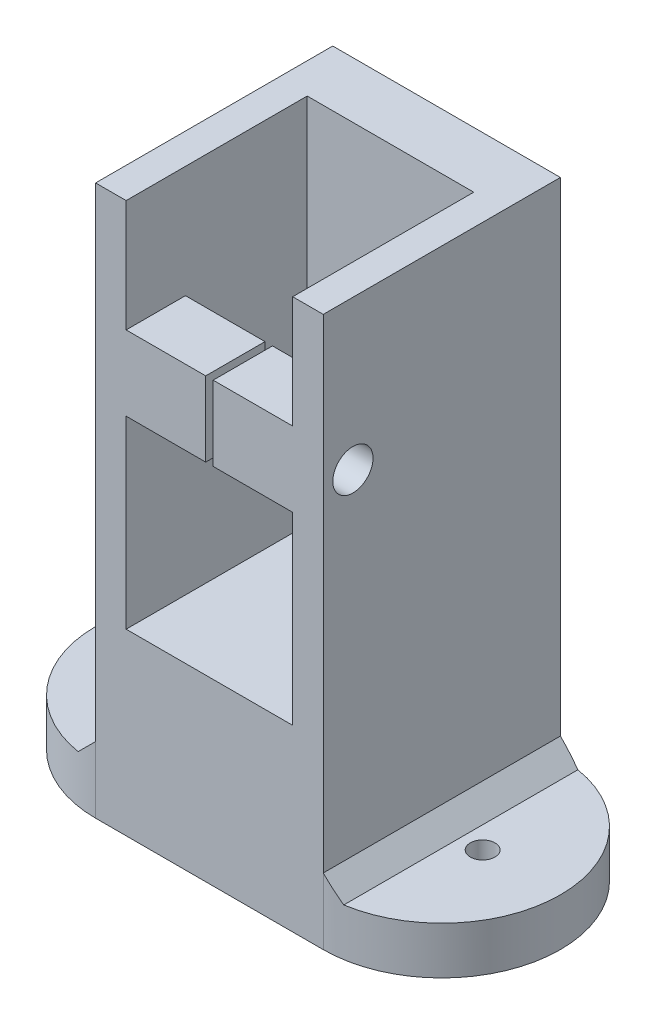
ISO-10303-21;
HEADER;
FILE_DESCRIPTION(('STEP AP214'),'2;1');
FILE_NAME('part.step','',(''),(''),'','','');
FILE_SCHEMA(('AUTOMOTIVE_DESIGN { 1 0 10303 214 1 1 1 1 }'));
ENDSEC;
DATA;
#1=APPLICATION_CONTEXT('core data for automotive mechanical design processes');
#2=APPLICATION_PROTOCOL_DEFINITION('international standard','automotive_design',2000,#1);
#3=PRODUCT_CONTEXT('',#1,'mechanical');
#4=PRODUCT('Part','Part','',(#3));
#5=PRODUCT_RELATED_PRODUCT_CATEGORY('part','',(#4));
#6=PRODUCT_DEFINITION_FORMATION('','',#4);
#7=PRODUCT_DEFINITION_CONTEXT('part definition',#1,'design');
#8=PRODUCT_DEFINITION('design','',#6,#7);
#9=PRODUCT_DEFINITION_SHAPE('','',#8);
#10=(LENGTH_UNIT() NAMED_UNIT(*) SI_UNIT(.MILLI.,.METRE.));
#11=(NAMED_UNIT(*) PLANE_ANGLE_UNIT() SI_UNIT($,.RADIAN.));
#12=(NAMED_UNIT(*) SI_UNIT($,.STERADIAN.) SOLID_ANGLE_UNIT());
#13=UNCERTAINTY_MEASURE_WITH_UNIT(LENGTH_MEASURE(1.E-05),#10,'distance_accuracy_value','');
#14=(GEOMETRIC_REPRESENTATION_CONTEXT(3) GLOBAL_UNCERTAINTY_ASSIGNED_CONTEXT((#13)) GLOBAL_UNIT_ASSIGNED_CONTEXT((#10,
#11,#12)) REPRESENTATION_CONTEXT('',''));
#15=CARTESIAN_POINT('',(0.,0.,0.));
#16=DIRECTION('',(0.,0.,1.));
#17=DIRECTION('',(1.,0.,0.));
#18=AXIS2_PLACEMENT_3D('',#15,#16,#17);
#19=CARTESIAN_POINT('',(4.09,73.66,-24.240000034));
#20=DIRECTION('',(-1.,0.,0.));
#21=DIRECTION('',(0.,-1.,0.));
#22=AXIS2_PLACEMENT_3D('',#19,#20,#21);
#23=PLANE('',#22);
#24=DIRECTION('',(0.,0.,-1.));
#25=VECTOR('',#24,1.);
#26=CARTESIAN_POINT('',(4.09,48.66,0.));
#27=LINE('',#26,#25);
#28=CARTESIAN_POINT('',(4.09,48.66,0.));
#29=VERTEX_POINT('',#28);
#30=CARTESIAN_POINT('',(4.09,48.66,-7.940000122));
#31=VERTEX_POINT('',#30);
#32=EDGE_CURVE('E658',#29,#31,#27,.T.);
#33=ORIENTED_EDGE('',*,*,#32,.F.);
#34=DIRECTION('',(0.,-1.,0.));
#35=VECTOR('',#34,1.);
#36=CARTESIAN_POINT('',(4.09,73.66,0.));
#37=LINE('',#36,#35);
#38=CARTESIAN_POINT('',(4.09,23.960000086,0.));
#39=VERTEX_POINT('',#38);
#40=EDGE_CURVE('E639',#29,#39,#37,.T.);
#41=ORIENTED_EDGE('',*,*,#40,.T.);
#42=DIRECTION('',(0.,0.,1.));
#43=VECTOR('',#42,1.);
#44=CARTESIAN_POINT('',(4.09,23.960000086,-24.240000034));
#45=LINE('',#44,#43);
#46=CARTESIAN_POINT('',(4.09,23.960000086,-24.240000034));
#47=VERTEX_POINT('',#46);
#48=EDGE_CURVE('E229',#47,#39,#45,.T.);
#49=ORIENTED_EDGE('',*,*,#48,.F.);
#50=DIRECTION('',(0.,-1.,0.));
#51=VECTOR('',#50,1.);
#52=CARTESIAN_POINT('',(4.09,73.66,-24.240000034));
#53=LINE('',#52,#51);
#54=CARTESIAN_POINT('',(4.09,73.66,-24.240000034));
#55=VERTEX_POINT('',#54);
#56=EDGE_CURVE('E216',#55,#47,#53,.T.);
#57=ORIENTED_EDGE('',*,*,#56,.F.);
#58=DIRECTION('',(0.,0.,1.));
#59=VECTOR('',#58,1.);
#60=CARTESIAN_POINT('',(4.09,73.66,-24.240000034));
#61=LINE('',#60,#59);
#62=CARTESIAN_POINT('',(4.09,73.66,0.));
#63=VERTEX_POINT('',#62);
#64=EDGE_CURVE('E222',#55,#63,#61,.T.);
#65=ORIENTED_EDGE('',*,*,#64,.T.);
#66=CARTESIAN_POINT('',(4.09,58.66,0.));
#67=VERTEX_POINT('',#66);
#68=EDGE_CURVE('E218',#63,#67,#37,.T.);
#69=ORIENTED_EDGE('',*,*,#68,.T.);
#70=DIRECTION('',(0.,0.,1.));
#71=VECTOR('',#70,1.);
#72=CARTESIAN_POINT('',(4.09,58.66,0.));
#73=LINE('',#72,#71);
#74=CARTESIAN_POINT('',(4.09,58.66,-7.940000122));
#75=VERTEX_POINT('',#74);
#76=EDGE_CURVE('E655',#75,#67,#73,.T.);
#77=ORIENTED_EDGE('',*,*,#76,.F.);
#78=DIRECTION('',(0.,1.,0.));
#79=VECTOR('',#78,1.);
#80=CARTESIAN_POINT('',(4.09,58.66,-7.940000122));
#81=LINE('',#80,#79);
#82=EDGE_CURVE('E72',#31,#75,#81,.T.);
#83=ORIENTED_EDGE('',*,*,#82,.F.);
#84=EDGE_LOOP('',(#33,#41,#49,#57,#65,#69,#77,#83));
#85=FACE_BOUND('',#84,.T.);
#86=ADVANCED_FACE('F47',(#85),#23,.F.);
#87=CARTESIAN_POINT('',(0.,6.35,-15.875));
#88=DIRECTION('',(0.,-1.,0.));
#89=DIRECTION('',(0.,0.,-1.));
#90=AXIS2_PLACEMENT_3D('',#87,#88,#89);
#91=CYLINDRICAL_SURFACE('',#90,15.875);
#92=CARTESIAN_POINT('',(0.,0.,-15.875));
#93=DIRECTION('',(0.,1.,0.));
#94=DIRECTION('',(0.,0.,1.));
#95=AXIS2_PLACEMENT_3D('',#92,#93,#94);
#96=CIRCLE('',#95,15.875);
#97=CARTESIAN_POINT('',(0.,0.,0.));
#98=VERTEX_POINT('',#97);
#99=CARTESIAN_POINT('',(0.,0.,-31.75));
#100=VERTEX_POINT('',#99);
#101=EDGE_CURVE('E282',#98,#100,#96,.F.);
#102=ORIENTED_EDGE('',*,*,#101,.F.);
#103=DIRECTION('',(0.,-1.,0.));
#104=VECTOR('',#103,1.);
#105=CARTESIAN_POINT('',(0.,6.35,0.));
#106=LINE('',#105,#104);
#107=CARTESIAN_POINT('',(0.,8.89,0.));
#108=VERTEX_POINT('',#107);
#109=EDGE_CURVE('E291',#108,#98,#106,.T.);
#110=ORIENTED_EDGE('',*,*,#109,.F.);
#111=CARTESIAN_POINT('',(0.,8.89,-15.875));
#112=DIRECTION('',(-0.707106781186545,0.70710678118655,0.));
#113=DIRECTION('',(-0.70710678118655,-0.707106781186545,0.));
#114=AXIS2_PLACEMENT_3D('',#111,#112,#113);
#115=ELLIPSE('',#114,22.4506403026728,15.875);
#116=CARTESIAN_POINT('',(-2.54000000000001,6.35,-0.20451739734861));
#117=VERTEX_POINT('',#116);
#118=EDGE_CURVE('E12',#108,#117,#115,.F.);
#119=ORIENTED_EDGE('',*,*,#118,.T.);
#120=CARTESIAN_POINT('',(0.,6.35,-15.875));
#121=DIRECTION('',(0.,1.,0.));
#122=DIRECTION('',(0.,0.,1.));
#123=AXIS2_PLACEMENT_3D('',#120,#121,#122);
#124=CIRCLE('',#123,15.875);
#125=CARTESIAN_POINT('',(-2.54000000000002,6.35,-31.5454826026514));
#126=VERTEX_POINT('',#125);
#127=EDGE_CURVE('E281',#117,#126,#124,.F.);
#128=ORIENTED_EDGE('',*,*,#127,.T.);
#129=CARTESIAN_POINT('',(0.,8.89,-15.875));
#130=DIRECTION('',(-0.707106781186545,0.70710678118655,0.));
#131=DIRECTION('',(-0.70710678118655,-0.707106781186545,0.));
#132=AXIS2_PLACEMENT_3D('',#129,#130,#131);
#133=ELLIPSE('',#132,22.4506403026728,15.875);
#134=CARTESIAN_POINT('',(0.,8.89,-31.75));
#135=VERTEX_POINT('',#134);
#136=EDGE_CURVE('E57',#126,#135,#133,.F.);
#137=ORIENTED_EDGE('',*,*,#136,.T.);
#138=DIRECTION('',(0.,-1.,0.));
#139=VECTOR('',#138,1.);
#140=CARTESIAN_POINT('',(0.,6.35,-31.75));
#141=LINE('',#140,#139);
#142=EDGE_CURVE('E285',#135,#100,#141,.T.);
#143=ORIENTED_EDGE('',*,*,#142,.T.);
#144=EDGE_LOOP('',(#102,#110,#119,#128,#137,#143));
#145=FACE_BOUND('',#144,.T.);
#146=ADVANCED_FACE('F313',(#145),#91,.T.);
#147=CARTESIAN_POINT('',(-5.461,6.35,-15.875));
#148=DIRECTION('',(0.,-1.,0.));
#149=DIRECTION('',(0.,0.,-1.));
#150=AXIS2_PLACEMENT_3D('',#147,#148,#149);
#151=CYLINDRICAL_SURFACE('',#150,1.651);
#152=CARTESIAN_POINT('',(-5.461,6.35,-15.875));
#153=DIRECTION('',(0.,1.,0.));
#154=DIRECTION('',(0.,0.,1.));
#155=AXIS2_PLACEMENT_3D('',#152,#153,#154);
#156=CIRCLE('',#155,1.651);
#157=CARTESIAN_POINT('',(-5.461,6.35,-14.224));
#158=VERTEX_POINT('',#157);
#159=EDGE_CURVE('E278',#158,#158,#156,.T.);
#160=ORIENTED_EDGE('',*,*,#159,.T.);
#161=EDGE_LOOP('',(#160));
#162=FACE_BOUND('',#161,.T.);
#163=CARTESIAN_POINT('',(-5.461,0.,-15.875));
#164=DIRECTION('',(0.,1.,0.));
#165=DIRECTION('',(0.,0.,1.));
#166=AXIS2_PLACEMENT_3D('',#163,#164,#165);
#167=CIRCLE('',#166,1.651);
#168=CARTESIAN_POINT('',(-5.461,0.,-14.224));
#169=VERTEX_POINT('',#168);
#170=EDGE_CURVE('E277',#169,#169,#167,.T.);
#171=ORIENTED_EDGE('',*,*,#170,.F.);
#172=EDGE_LOOP('',(#171));
#173=FACE_BOUND('',#172,.T.);
#174=ADVANCED_FACE('F341',(#162,#173),#151,.F.);
#175=CARTESIAN_POINT('',(0.,6.35,0.));
#176=DIRECTION('',(0.,1.,0.));
#177=DIRECTION('',(0.,0.,1.));
#178=AXIS2_PLACEMENT_3D('',#175,#176,#177);
#179=PLANE('',#178);
#180=ORIENTED_EDGE('',*,*,#159,.F.);
#181=EDGE_LOOP('',(#180));
#182=FACE_BOUND('',#181,.T.);
#183=ORIENTED_EDGE('',*,*,#127,.F.);
#184=DIRECTION('',(0.,0.,-1.));
#185=VECTOR('',#184,1.);
#186=CARTESIAN_POINT('',(-2.54000000000002,6.35,-31.75));
#187=LINE('',#186,#185);
#188=EDGE_CURVE('E299',#117,#126,#187,.T.);
#189=ORIENTED_EDGE('',*,*,#188,.T.);
#190=EDGE_LOOP('',(#183,#189));
#191=FACE_BOUND('',#190,.T.);
#192=ADVANCED_FACE('F339',(#182,#191),#179,.T.);
#193=CARTESIAN_POINT('',(0.,0.,0.));
#194=DIRECTION('',(0.,1.,0.));
#195=DIRECTION('',(0.,0.,1.));
#196=AXIS2_PLACEMENT_3D('',#193,#194,#195);
#197=PLANE('',#196);
#198=ORIENTED_EDGE('',*,*,#170,.T.);
#199=EDGE_LOOP('',(#198));
#200=FACE_BOUND('',#199,.T.);
#201=ORIENTED_EDGE('',*,*,#101,.T.);
#202=DIRECTION('',(1.,0.,0.));
#203=VECTOR('',#202,1.);
#204=CARTESIAN_POINT('',(0.,0.,-31.75));
#205=LINE('',#204,#203);
#206=CARTESIAN_POINT('',(30.48,0.,-31.75));
#207=VERTEX_POINT('',#206);
#208=EDGE_CURVE('E263',#100,#207,#205,.T.);
#209=ORIENTED_EDGE('',*,*,#208,.T.);
#210=CARTESIAN_POINT('',(30.48,0.,-15.875));
#211=DIRECTION('',(0.,1.,0.));
#212=DIRECTION('',(0.,0.,1.));
#213=AXIS2_PLACEMENT_3D('',#210,#211,#212);
#214=CIRCLE('',#213,15.875);
#215=CARTESIAN_POINT('',(30.48,0.,0.));
#216=VERTEX_POINT('',#215);
#217=EDGE_CURVE('E237',#216,#207,#214,.T.);
#218=ORIENTED_EDGE('',*,*,#217,.F.);
#219=DIRECTION('',(1.,0.,0.));
#220=VECTOR('',#219,1.);
#221=CARTESIAN_POINT('',(0.,0.,0.));
#222=LINE('',#221,#220);
#223=EDGE_CURVE('E248',#98,#216,#222,.T.);
#224=ORIENTED_EDGE('',*,*,#223,.F.);
#225=EDGE_LOOP('',(#201,#209,#218,#224));
#226=FACE_BOUND('',#225,.T.);
#227=CARTESIAN_POINT('',(35.941,0.,-15.875));
#228=DIRECTION('',(0.,1.,0.));
#229=DIRECTION('',(0.,0.,1.));
#230=AXIS2_PLACEMENT_3D('',#227,#228,#229);
#231=CIRCLE('',#230,1.651);
#232=CARTESIAN_POINT('',(35.941,0.,-14.224));
#233=VERTEX_POINT('',#232);
#234=EDGE_CURVE('E224',#233,#233,#231,.T.);
#235=ORIENTED_EDGE('',*,*,#234,.T.);
#236=EDGE_LOOP('',(#235));
#237=FACE_BOUND('',#236,.T.);
#238=ADVANCED_FACE('F336',(#200,#226,#237),#197,.F.);
#239=CARTESIAN_POINT('',(0.,73.66,0.));
#240=DIRECTION('',(0.,0.,-1.));
#241=DIRECTION('',(-1.,0.,0.));
#242=AXIS2_PLACEMENT_3D('',#239,#240,#241);
#243=PLANE('',#242);
#244=DIRECTION('',(1.,0.,0.));
#245=VECTOR('',#244,1.);
#246=CARTESIAN_POINT('',(4.09,23.960000086,0.));
#247=LINE('',#246,#245);
#248=CARTESIAN_POINT('',(26.39,23.960000086,0.));
#249=VERTEX_POINT('',#248);
#250=EDGE_CURVE('E213',#39,#249,#247,.T.);
#251=ORIENTED_EDGE('',*,*,#250,.F.);
#252=ORIENTED_EDGE('',*,*,#40,.F.);
#253=DIRECTION('',(-1.,0.,0.));
#254=VECTOR('',#253,1.);
#255=CARTESIAN_POINT('',(28.0088528042796,48.66,0.));
#256=LINE('',#255,#254);
#257=CARTESIAN_POINT('',(14.74,48.66,0.));
#258=VERTEX_POINT('',#257);
#259=EDGE_CURVE('E650',#258,#29,#256,.T.);
#260=ORIENTED_EDGE('',*,*,#259,.F.);
#261=DIRECTION('',(0.,-1.,0.));
#262=VECTOR('',#261,1.);
#263=CARTESIAN_POINT('',(14.74,58.66,0.));
#264=LINE('',#263,#262);
#265=CARTESIAN_POINT('',(14.74,58.66,0.));
#266=VERTEX_POINT('',#265);
#267=EDGE_CURVE('E664',#266,#258,#264,.T.);
#268=ORIENTED_EDGE('',*,*,#267,.F.);
#269=DIRECTION('',(-1.,0.,0.));
#270=VECTOR('',#269,1.);
#271=CARTESIAN_POINT('',(28.0088528042796,58.66,0.));
#272=LINE('',#271,#270);
#273=EDGE_CURVE('E648',#266,#67,#272,.T.);
#274=ORIENTED_EDGE('',*,*,#273,.T.);
#275=ORIENTED_EDGE('',*,*,#68,.F.);
#276=DIRECTION('',(1.,0.,0.));
#277=VECTOR('',#276,1.);
#278=CARTESIAN_POINT('',(0.,73.66,0.));
#279=LINE('',#278,#277);
#280=CARTESIAN_POINT('',(0.,73.66,0.));
#281=VERTEX_POINT('',#280);
#282=EDGE_CURVE('E249',#281,#63,#279,.T.);
#283=ORIENTED_EDGE('',*,*,#282,.F.);
#284=DIRECTION('',(0.,-1.,0.));
#285=VECTOR('',#284,1.);
#286=CARTESIAN_POINT('',(0.,73.66,0.));
#287=LINE('',#286,#285);
#288=EDGE_CURVE('E260',#281,#108,#287,.T.);
#289=ORIENTED_EDGE('',*,*,#288,.T.);
#290=ORIENTED_EDGE('',*,*,#109,.T.);
#291=ORIENTED_EDGE('',*,*,#223,.T.);
#292=DIRECTION('',(0.,-1.,0.));
#293=VECTOR('',#292,1.);
#294=CARTESIAN_POINT('',(30.48,6.35,0.));
#295=LINE('',#294,#293);
#296=CARTESIAN_POINT('',(30.48,8.89000000000001,0.));
#297=VERTEX_POINT('',#296);
#298=EDGE_CURVE('E246',#297,#216,#295,.T.);
#299=ORIENTED_EDGE('',*,*,#298,.F.);
#300=DIRECTION('',(0.,-1.,0.));
#301=VECTOR('',#300,1.);
#302=CARTESIAN_POINT('',(30.48,73.66,0.));
#303=LINE('',#302,#301);
#304=CARTESIAN_POINT('',(30.48,73.66,0.));
#305=VERTEX_POINT('',#304);
#306=EDGE_CURVE('E274',#305,#297,#303,.T.);
#307=ORIENTED_EDGE('',*,*,#306,.F.);
#308=CARTESIAN_POINT('',(26.39,73.66,0.));
#309=VERTEX_POINT('',#308);
#310=EDGE_CURVE('E211',#309,#305,#279,.T.);
#311=ORIENTED_EDGE('',*,*,#310,.F.);
#312=DIRECTION('',(0.,1.,0.));
#313=VECTOR('',#312,1.);
#314=CARTESIAN_POINT('',(26.39,73.66,0.));
#315=LINE('',#314,#313);
#316=CARTESIAN_POINT('',(26.39,58.66,0.));
#317=VERTEX_POINT('',#316);
#318=EDGE_CURVE('E202',#317,#309,#315,.T.);
#319=ORIENTED_EDGE('',*,*,#318,.F.);
#320=DIRECTION('',(1.,0.,0.));
#321=VECTOR('',#320,1.);
#322=CARTESIAN_POINT('',(2.47114719572036,58.66,0.));
#323=LINE('',#322,#321);
#324=CARTESIAN_POINT('',(15.74,58.66,0.));
#325=VERTEX_POINT('',#324);
#326=EDGE_CURVE('E187',#325,#317,#323,.T.);
#327=ORIENTED_EDGE('',*,*,#326,.F.);
#328=DIRECTION('',(0.,1.,0.));
#329=VECTOR('',#328,1.);
#330=CARTESIAN_POINT('',(15.74,58.66,0.));
#331=LINE('',#330,#329);
#332=CARTESIAN_POINT('',(15.74,48.66,0.));
#333=VERTEX_POINT('',#332);
#334=EDGE_CURVE('E677',#333,#325,#331,.T.);
#335=ORIENTED_EDGE('',*,*,#334,.F.);
#336=DIRECTION('',(1.,0.,0.));
#337=VECTOR('',#336,1.);
#338=CARTESIAN_POINT('',(2.47114719572036,48.66,0.));
#339=LINE('',#338,#337);
#340=CARTESIAN_POINT('',(26.39,48.66,0.));
#341=VERTEX_POINT('',#340);
#342=EDGE_CURVE('E624',#333,#341,#339,.T.);
#343=ORIENTED_EDGE('',*,*,#342,.T.);
#344=EDGE_CURVE('E212',#249,#341,#315,.T.);
#345=ORIENTED_EDGE('',*,*,#344,.F.);
#346=EDGE_LOOP('',(#251,#252,#260,#268,#274,#275,#283,#289,#290,#291,#299,#307,#311,#319,#327,
#335,#343,#345));
#347=FACE_BOUND('',#346,.T.);
#348=ADVANCED_FACE('F209',(#347),#243,.F.);
#349=CARTESIAN_POINT('',(30.48,73.66,0.));
#350=DIRECTION('',(-1.,0.,0.));
#351=DIRECTION('',(0.,0.,1.));
#352=AXIS2_PLACEMENT_3D('',#349,#350,#351);
#353=PLANE('',#352);
#354=CARTESIAN_POINT('',(30.48,53.66,-3.970000061));
#355=DIRECTION('',(-1.,0.,0.));
#356=DIRECTION('',(0.,0.,1.));
#357=AXIS2_PLACEMENT_3D('',#354,#355,#356);
#358=CIRCLE('',#357,2.694750008);
#359=CARTESIAN_POINT('',(30.48,53.66,-1.275250053));
#360=VERTEX_POINT('',#359);
#361=EDGE_CURVE('E205',#360,#360,#358,.T.);
#362=ORIENTED_EDGE('',*,*,#361,.T.);
#363=EDGE_LOOP('',(#362));
#364=FACE_BOUND('',#363,.T.);
#365=ORIENTED_EDGE('',*,*,#306,.T.);
#366=DIRECTION('',(0.,0.,-1.));
#367=VECTOR('',#366,1.);
#368=CARTESIAN_POINT('',(30.48,8.89000000000001,0.));
#369=LINE('',#368,#367);
#370=CARTESIAN_POINT('',(30.48,8.89000000000001,-31.75));
#371=VERTEX_POINT('',#370);
#372=EDGE_CURVE('E294',#297,#371,#369,.T.);
#373=ORIENTED_EDGE('',*,*,#372,.T.);
#374=DIRECTION('',(0.,-1.,0.));
#375=VECTOR('',#374,1.);
#376=CARTESIAN_POINT('',(30.48,73.66,-31.75));
#377=LINE('',#376,#375);
#378=CARTESIAN_POINT('',(30.48,73.66,-31.75));
#379=VERTEX_POINT('',#378);
#380=EDGE_CURVE('E271',#379,#371,#377,.T.);
#381=ORIENTED_EDGE('',*,*,#380,.F.);
#382=DIRECTION('',(0.,0.,-1.));
#383=VECTOR('',#382,1.);
#384=CARTESIAN_POINT('',(30.48,73.66,0.));
#385=LINE('',#384,#383);
#386=EDGE_CURVE('E252',#305,#379,#385,.T.);
#387=ORIENTED_EDGE('',*,*,#386,.F.);
#388=EDGE_LOOP('',(#365,#373,#381,#387));
#389=FACE_BOUND('',#388,.T.);
#390=ADVANCED_FACE('F385',(#364,#389),#353,.F.);
#391=CARTESIAN_POINT('',(0.,73.66,-31.75));
#392=DIRECTION('',(0.,0.,-1.));
#393=DIRECTION('',(-1.,0.,0.));
#394=AXIS2_PLACEMENT_3D('',#391,#392,#393);
#395=PLANE('',#394);
#396=CARTESIAN_POINT('',(15.24,28.370000086,-31.75));
#397=DIRECTION('',(0.,0.,-1.));
#398=DIRECTION('',(-1.,0.,0.));
#399=AXIS2_PLACEMENT_3D('',#396,#397,#398);
#400=CIRCLE('',#399,2.99085000000001);
#401=CARTESIAN_POINT('',(12.24915,28.370000086,-31.75));
#402=VERTEX_POINT('',#401);
#403=EDGE_CURVE('E640',#402,#402,#400,.T.);
#404=ORIENTED_EDGE('',*,*,#403,.F.);
#405=EDGE_LOOP('',(#404));
#406=FACE_BOUND('',#405,.T.);
#407=ORIENTED_EDGE('',*,*,#208,.F.);
#408=ORIENTED_EDGE('',*,*,#142,.F.);
#409=DIRECTION('',(0.,-1.,0.));
#410=VECTOR('',#409,1.);
#411=CARTESIAN_POINT('',(0.,73.66,-31.75));
#412=LINE('',#411,#410);
#413=CARTESIAN_POINT('',(0.,73.66,-31.75));
#414=VERTEX_POINT('',#413);
#415=EDGE_CURVE('E268',#414,#135,#412,.T.);
#416=ORIENTED_EDGE('',*,*,#415,.F.);
#417=DIRECTION('',(1.,0.,0.));
#418=VECTOR('',#417,1.);
#419=CARTESIAN_POINT('',(0.,73.66,-31.75));
#420=LINE('',#419,#418);
#421=EDGE_CURVE('E254',#414,#379,#420,.T.);
#422=ORIENTED_EDGE('',*,*,#421,.T.);
#423=ORIENTED_EDGE('',*,*,#380,.T.);
#424=DIRECTION('',(0.,-1.,0.));
#425=VECTOR('',#424,1.);
#426=CARTESIAN_POINT('',(30.48,6.35,-31.75));
#427=LINE('',#426,#425);
#428=EDGE_CURVE('E240',#371,#207,#427,.T.);
#429=ORIENTED_EDGE('',*,*,#428,.T.);
#430=EDGE_LOOP('',(#407,#408,#416,#422,#423,#429));
#431=FACE_BOUND('',#430,.T.);
#432=ADVANCED_FACE('F333',(#406,#431),#395,.T.);
#433=CARTESIAN_POINT('',(0.,73.66,0.));
#434=DIRECTION('',(-1.,0.,0.));
#435=DIRECTION('',(0.,0.,1.));
#436=AXIS2_PLACEMENT_3D('',#433,#434,#435);
#437=PLANE('',#436);
#438=CARTESIAN_POINT('',(0.,53.66,-3.970000061));
#439=DIRECTION('',(-1.,0.,0.));
#440=DIRECTION('',(0.,0.,1.));
#441=AXIS2_PLACEMENT_3D('',#438,#439,#440);
#442=CIRCLE('',#441,2.694750008);
#443=CARTESIAN_POINT('',(0.,53.66,-1.275250053));
#444=VERTEX_POINT('',#443);
#445=EDGE_CURVE('E690',#444,#444,#442,.T.);
#446=ORIENTED_EDGE('',*,*,#445,.F.);
#447=EDGE_LOOP('',(#446));
#448=FACE_BOUND('',#447,.T.);
#449=ORIENTED_EDGE('',*,*,#415,.T.);
#450=DIRECTION('',(0.,0.,1.));
#451=VECTOR('',#450,1.);
#452=CARTESIAN_POINT('',(0.,8.89,0.));
#453=LINE('',#452,#451);
#454=EDGE_CURVE('E302',#135,#108,#453,.T.);
#455=ORIENTED_EDGE('',*,*,#454,.T.);
#456=ORIENTED_EDGE('',*,*,#288,.F.);
#457=DIRECTION('',(0.,0.,-1.));
#458=VECTOR('',#457,1.);
#459=CARTESIAN_POINT('',(0.,73.66,0.));
#460=LINE('',#459,#458);
#461=EDGE_CURVE('E257',#281,#414,#460,.T.);
#462=ORIENTED_EDGE('',*,*,#461,.T.);
#463=EDGE_LOOP('',(#449,#455,#456,#462));
#464=FACE_BOUND('',#463,.T.);
#465=ADVANCED_FACE('F320',(#448,#464),#437,.T.);
#466=CARTESIAN_POINT('',(0.,73.66,0.));
#467=DIRECTION('',(0.,1.,0.));
#468=DIRECTION('',(0.,0.,1.));
#469=AXIS2_PLACEMENT_3D('',#466,#467,#468);
#470=PLANE('',#469);
#471=ORIENTED_EDGE('',*,*,#64,.F.);
#472=DIRECTION('',(-1.,0.,0.));
#473=VECTOR('',#472,1.);
#474=CARTESIAN_POINT('',(4.09,73.66,-24.240000034));
#475=LINE('',#474,#473);
#476=CARTESIAN_POINT('',(26.39,73.66,-24.240000034));
#477=VERTEX_POINT('',#476);
#478=EDGE_CURVE('E232',#477,#55,#475,.T.);
#479=ORIENTED_EDGE('',*,*,#478,.F.);
#480=DIRECTION('',(0.,0.,1.));
#481=VECTOR('',#480,1.);
#482=CARTESIAN_POINT('',(26.39,73.66,-24.240000034));
#483=LINE('',#482,#481);
#484=EDGE_CURVE('E225',#477,#309,#483,.T.);
#485=ORIENTED_EDGE('',*,*,#484,.T.);
#486=ORIENTED_EDGE('',*,*,#310,.T.);
#487=ORIENTED_EDGE('',*,*,#386,.T.);
#488=ORIENTED_EDGE('',*,*,#421,.F.);
#489=ORIENTED_EDGE('',*,*,#461,.F.);
#490=ORIENTED_EDGE('',*,*,#282,.T.);
#491=EDGE_LOOP('',(#471,#479,#485,#486,#487,#488,#489,#490));
#492=FACE_BOUND('',#491,.T.);
#493=ADVANCED_FACE('F329',(#492),#470,.T.);
#494=CARTESIAN_POINT('',(35.941,6.35,-15.875));
#495=DIRECTION('',(0.,-1.,0.));
#496=DIRECTION('',(0.,0.,-1.));
#497=AXIS2_PLACEMENT_3D('',#494,#495,#496);
#498=CYLINDRICAL_SURFACE('',#497,1.651);
#499=CARTESIAN_POINT('',(35.941,6.35,-15.875));
#500=DIRECTION('',(0.,1.,0.));
#501=DIRECTION('',(0.,0.,1.));
#502=AXIS2_PLACEMENT_3D('',#499,#500,#501);
#503=CIRCLE('',#502,1.651);
#504=CARTESIAN_POINT('',(35.941,6.35,-14.224));
#505=VERTEX_POINT('',#504);
#506=EDGE_CURVE('E233',#505,#505,#503,.T.);
#507=ORIENTED_EDGE('',*,*,#506,.T.);
#508=EDGE_LOOP('',(#507));
#509=FACE_BOUND('',#508,.T.);
#510=ORIENTED_EDGE('',*,*,#234,.F.);
#511=EDGE_LOOP('',(#510));
#512=FACE_BOUND('',#511,.T.);
#513=ADVANCED_FACE('F374',(#509,#512),#498,.F.);
#514=CARTESIAN_POINT('',(30.48,6.35,-15.875));
#515=DIRECTION('',(0.,-1.,0.));
#516=DIRECTION('',(0.,0.,-1.));
#517=AXIS2_PLACEMENT_3D('',#514,#515,#516);
#518=CYLINDRICAL_SURFACE('',#517,15.875);
#519=ORIENTED_EDGE('',*,*,#217,.T.);
#520=ORIENTED_EDGE('',*,*,#428,.F.);
#521=CARTESIAN_POINT('',(30.48,8.89000000000001,-15.875));
#522=DIRECTION('',(-0.707106781186549,-0.707106781186546,0.));
#523=DIRECTION('',(0.707106781186546,-0.707106781186549,0.));
#524=AXIS2_PLACEMENT_3D('',#521,#522,#523);
#525=ELLIPSE('',#524,22.4506403026729,15.875);
#526=CARTESIAN_POINT('',(33.02,6.35,-31.5454826026514));
#527=VERTEX_POINT('',#526);
#528=EDGE_CURVE('E305',#371,#527,#525,.T.);
#529=ORIENTED_EDGE('',*,*,#528,.T.);
#530=CARTESIAN_POINT('',(30.48,6.35,-15.875));
#531=DIRECTION('',(0.,1.,0.));
#532=DIRECTION('',(0.,0.,1.));
#533=AXIS2_PLACEMENT_3D('',#530,#531,#532);
#534=CIRCLE('',#533,15.875);
#535=CARTESIAN_POINT('',(33.02,6.35,-0.204517397348607));
#536=VERTEX_POINT('',#535);
#537=EDGE_CURVE('E236',#536,#527,#534,.T.);
#538=ORIENTED_EDGE('',*,*,#537,.F.);
#539=CARTESIAN_POINT('',(30.48,8.89000000000001,-15.875));
#540=DIRECTION('',(-0.707106781186549,-0.707106781186546,0.));
#541=DIRECTION('',(0.707106781186546,-0.707106781186549,0.));
#542=AXIS2_PLACEMENT_3D('',#539,#540,#541);
#543=ELLIPSE('',#542,22.4506403026729,15.875);
#544=EDGE_CURVE('E307',#536,#297,#543,.T.);
#545=ORIENTED_EDGE('',*,*,#544,.T.);
#546=ORIENTED_EDGE('',*,*,#298,.T.);
#547=EDGE_LOOP('',(#519,#520,#529,#538,#545,#546));
#548=FACE_BOUND('',#547,.T.);
#549=ADVANCED_FACE('F370',(#548),#518,.T.);
#550=CARTESIAN_POINT('',(0.,6.35,0.));
#551=DIRECTION('',(0.,1.,0.));
#552=DIRECTION('',(0.,0.,1.));
#553=AXIS2_PLACEMENT_3D('',#550,#551,#552);
#554=PLANE('',#553);
#555=ORIENTED_EDGE('',*,*,#506,.F.);
#556=EDGE_LOOP('',(#555));
#557=FACE_BOUND('',#556,.T.);
#558=ORIENTED_EDGE('',*,*,#537,.T.);
#559=DIRECTION('',(0.,0.,1.));
#560=VECTOR('',#559,1.);
#561=CARTESIAN_POINT('',(33.02,6.35,0.));
#562=LINE('',#561,#560);
#563=EDGE_CURVE('E297',#527,#536,#562,.T.);
#564=ORIENTED_EDGE('',*,*,#563,.T.);
#565=EDGE_LOOP('',(#558,#564));
#566=FACE_BOUND('',#565,.T.);
#567=ADVANCED_FACE('F367',(#557,#566),#554,.T.);
#568=CARTESIAN_POINT('',(26.39,73.66,-24.240000034));
#569=DIRECTION('',(1.,0.,0.));
#570=DIRECTION('',(0.,0.,-1.));
#571=AXIS2_PLACEMENT_3D('',#568,#569,#570);
#572=PLANE('',#571);
#573=DIRECTION('',(0.,1.,0.));
#574=VECTOR('',#573,1.);
#575=CARTESIAN_POINT('',(26.39,58.66,-7.940000122));
#576=LINE('',#575,#574);
#577=CARTESIAN_POINT('',(26.39,48.66,-7.940000122));
#578=VERTEX_POINT('',#577);
#579=CARTESIAN_POINT('',(26.39,58.66,-7.940000122));
#580=VERTEX_POINT('',#579);
#581=EDGE_CURVE('E64',#578,#580,#576,.T.);
#582=ORIENTED_EDGE('',*,*,#581,.T.);
#583=DIRECTION('',(0.,0.,1.));
#584=VECTOR('',#583,1.);
#585=CARTESIAN_POINT('',(26.39,58.66,0.));
#586=LINE('',#585,#584);
#587=EDGE_CURVE('E191',#580,#317,#586,.T.);
#588=ORIENTED_EDGE('',*,*,#587,.T.);
#589=ORIENTED_EDGE('',*,*,#318,.T.);
#590=ORIENTED_EDGE('',*,*,#484,.F.);
#591=DIRECTION('',(0.,1.,0.));
#592=VECTOR('',#591,1.);
#593=CARTESIAN_POINT('',(26.39,73.66,-24.240000034));
#594=LINE('',#593,#592);
#595=CARTESIAN_POINT('',(26.39,23.960000086,-24.240000034));
#596=VERTEX_POINT('',#595);
#597=EDGE_CURVE('E627',#596,#477,#594,.T.);
#598=ORIENTED_EDGE('',*,*,#597,.F.);
#599=DIRECTION('',(0.,0.,1.));
#600=VECTOR('',#599,1.);
#601=CARTESIAN_POINT('',(26.39,23.960000086,-24.240000034));
#602=LINE('',#601,#600);
#603=EDGE_CURVE('E227',#596,#249,#602,.T.);
#604=ORIENTED_EDGE('',*,*,#603,.T.);
#605=ORIENTED_EDGE('',*,*,#344,.T.);
#606=DIRECTION('',(0.,0.,-1.));
#607=VECTOR('',#606,1.);
#608=CARTESIAN_POINT('',(26.39,48.66,0.));
#609=LINE('',#608,#607);
#610=EDGE_CURVE('E626',#341,#578,#609,.T.);
#611=ORIENTED_EDGE('',*,*,#610,.T.);
#612=EDGE_LOOP('',(#582,#588,#589,#590,#598,#604,#605,#611));
#613=FACE_BOUND('',#612,.T.);
#614=ADVANCED_FACE('F200',(#613),#572,.F.);
#615=CARTESIAN_POINT('',(4.09,23.960000086,-24.240000034));
#616=DIRECTION('',(0.,-1.,0.));
#617=DIRECTION('',(0.,0.,-1.));
#618=AXIS2_PLACEMENT_3D('',#615,#616,#617);
#619=PLANE('',#618);
#620=ORIENTED_EDGE('',*,*,#250,.T.);
#621=ORIENTED_EDGE('',*,*,#603,.F.);
#622=DIRECTION('',(1.,0.,0.));
#623=VECTOR('',#622,1.);
#624=CARTESIAN_POINT('',(4.09,23.960000086,-24.240000034));
#625=LINE('',#624,#623);
#626=EDGE_CURVE('E632',#47,#596,#625,.T.);
#627=ORIENTED_EDGE('',*,*,#626,.F.);
#628=ORIENTED_EDGE('',*,*,#48,.T.);
#629=EDGE_LOOP('',(#620,#621,#627,#628));
#630=FACE_BOUND('',#629,.T.);
#631=ADVANCED_FACE('F365',(#630),#619,.F.);
#632=CARTESIAN_POINT('',(0.,0.,-24.240000034));
#633=DIRECTION('',(0.,0.,1.));
#634=DIRECTION('',(1.,0.,0.));
#635=AXIS2_PLACEMENT_3D('',#632,#633,#634);
#636=PLANE('',#635);
#637=CARTESIAN_POINT('',(15.24,28.370000086,-24.240000034));
#638=DIRECTION('',(0.,0.,1.));
#639=DIRECTION('',(1.,0.,0.));
#640=AXIS2_PLACEMENT_3D('',#637,#638,#639);
#641=CIRCLE('',#640,2.99085000000001);
#642=CARTESIAN_POINT('',(18.23085,28.370000086,-24.240000034));
#643=VERTEX_POINT('',#642);
#644=EDGE_CURVE('E642',#643,#643,#641,.T.);
#645=ORIENTED_EDGE('',*,*,#644,.F.);
#646=EDGE_LOOP('',(#645));
#647=FACE_BOUND('',#646,.T.);
#648=ORIENTED_EDGE('',*,*,#56,.T.);
#649=ORIENTED_EDGE('',*,*,#626,.T.);
#650=ORIENTED_EDGE('',*,*,#597,.T.);
#651=ORIENTED_EDGE('',*,*,#478,.T.);
#652=EDGE_LOOP('',(#648,#649,#650,#651));
#653=FACE_BOUND('',#652,.T.);
#654=ADVANCED_FACE('F531',(#647,#653),#636,.T.);
#655=CARTESIAN_POINT('',(15.24,28.370000086,-34.400000034));
#656=DIRECTION('',(0.,0.,1.));
#657=DIRECTION('',(1.,0.,0.));
#658=AXIS2_PLACEMENT_3D('',#655,#656,#657);
#659=CYLINDRICAL_SURFACE('',#658,2.99085000000001);
#660=ORIENTED_EDGE('',*,*,#403,.T.);
#661=EDGE_LOOP('',(#660));
#662=FACE_BOUND('',#661,.T.);
#663=ORIENTED_EDGE('',*,*,#644,.T.);
#664=EDGE_LOOP('',(#663));
#665=FACE_BOUND('',#664,.T.);
#666=ADVANCED_FACE('F523',(#662,#665),#659,.F.);
#667=CARTESIAN_POINT('',(30.48,8.89000000000001,0.));
#668=DIRECTION('',(-0.707106781186549,-0.707106781186546,0.));
#669=DIRECTION('',(0.,0.,-1.));
#670=AXIS2_PLACEMENT_3D('',#667,#668,#669);
#671=PLANE('',#670);
#672=ORIENTED_EDGE('',*,*,#544,.F.);
#673=ORIENTED_EDGE('',*,*,#563,.F.);
#674=ORIENTED_EDGE('',*,*,#528,.F.);
#675=ORIENTED_EDGE('',*,*,#372,.F.);
#676=EDGE_LOOP('',(#672,#673,#674,#675));
#677=FACE_BOUND('',#676,.T.);
#678=ADVANCED_FACE('F516',(#677),#671,.F.);
#679=CARTESIAN_POINT('',(-2.54000000000001,6.35,0.));
#680=DIRECTION('',(-0.707106781186545,0.70710678118655,0.));
#681=DIRECTION('',(0.,0.,1.));
#682=AXIS2_PLACEMENT_3D('',#679,#680,#681);
#683=PLANE('',#682);
#684=ORIENTED_EDGE('',*,*,#118,.F.);
#685=ORIENTED_EDGE('',*,*,#454,.F.);
#686=ORIENTED_EDGE('',*,*,#136,.F.);
#687=ORIENTED_EDGE('',*,*,#188,.F.);
#688=EDGE_LOOP('',(#684,#685,#686,#687));
#689=FACE_BOUND('',#688,.T.);
#690=ADVANCED_FACE('F50',(#689),#683,.T.);
#691=CARTESIAN_POINT('',(28.0088528042796,48.66,0.));
#692=DIRECTION('',(0.,1.,0.));
#693=DIRECTION('',(-1.,0.,0.));
#694=AXIS2_PLACEMENT_3D('',#691,#692,#693);
#695=PLANE('',#694);
#696=DIRECTION('',(0.,0.,-1.));
#697=VECTOR('',#696,1.);
#698=CARTESIAN_POINT('',(14.74,48.66,0.));
#699=LINE('',#698,#697);
#700=CARTESIAN_POINT('',(14.74,48.66,-7.940000122));
#701=VERTEX_POINT('',#700);
#702=EDGE_CURVE('E667',#258,#701,#699,.T.);
#703=ORIENTED_EDGE('',*,*,#702,.F.);
#704=ORIENTED_EDGE('',*,*,#259,.T.);
#705=ORIENTED_EDGE('',*,*,#32,.T.);
#706=DIRECTION('',(-1.,0.,0.));
#707=VECTOR('',#706,1.);
#708=CARTESIAN_POINT('',(28.0088528042796,48.66,-7.940000122));
#709=LINE('',#708,#707);
#710=EDGE_CURVE('E656',#701,#31,#709,.T.);
#711=ORIENTED_EDGE('',*,*,#710,.F.);
#712=EDGE_LOOP('',(#703,#704,#705,#711));
#713=FACE_BOUND('',#712,.T.);
#714=ADVANCED_FACE('F497',(#713),#695,.F.);
#715=CARTESIAN_POINT('',(28.0088528042796,58.66,-7.940000122));
#716=DIRECTION('',(0.,0.,1.));
#717=DIRECTION('',(1.,0.,0.));
#718=AXIS2_PLACEMENT_3D('',#715,#716,#717);
#719=PLANE('',#718);
#720=DIRECTION('',(0.,1.,0.));
#721=VECTOR('',#720,1.);
#722=CARTESIAN_POINT('',(14.74,58.66,-7.940000122));
#723=LINE('',#722,#721);
#724=CARTESIAN_POINT('',(14.74,58.66,-7.940000122));
#725=VERTEX_POINT('',#724);
#726=EDGE_CURVE('E645',#701,#725,#723,.T.);
#727=ORIENTED_EDGE('',*,*,#726,.F.);
#728=ORIENTED_EDGE('',*,*,#710,.T.);
#729=ORIENTED_EDGE('',*,*,#82,.T.);
#730=DIRECTION('',(-1.,0.,0.));
#731=VECTOR('',#730,1.);
#732=CARTESIAN_POINT('',(28.0088528042796,58.66,-7.940000122));
#733=LINE('',#732,#731);
#734=EDGE_CURVE('E652',#725,#75,#733,.T.);
#735=ORIENTED_EDGE('',*,*,#734,.F.);
#736=EDGE_LOOP('',(#727,#728,#729,#735));
#737=FACE_BOUND('',#736,.T.);
#738=ADVANCED_FACE('F489',(#737),#719,.F.);
#739=CARTESIAN_POINT('',(28.0088528042796,58.66,0.));
#740=DIRECTION('',(0.,-1.,0.));
#741=DIRECTION('',(1.,0.,0.));
#742=AXIS2_PLACEMENT_3D('',#739,#740,#741);
#743=PLANE('',#742);
#744=DIRECTION('',(0.,0.,1.));
#745=VECTOR('',#744,1.);
#746=CARTESIAN_POINT('',(14.74,58.66,0.));
#747=LINE('',#746,#745);
#748=EDGE_CURVE('E661',#725,#266,#747,.T.);
#749=ORIENTED_EDGE('',*,*,#748,.F.);
#750=ORIENTED_EDGE('',*,*,#734,.T.);
#751=ORIENTED_EDGE('',*,*,#76,.T.);
#752=ORIENTED_EDGE('',*,*,#273,.F.);
#753=EDGE_LOOP('',(#749,#750,#751,#752));
#754=FACE_BOUND('',#753,.T.);
#755=ADVANCED_FACE('F399',(#754),#743,.F.);
#756=CARTESIAN_POINT('',(14.74,0.,0.));
#757=DIRECTION('',(1.,0.,0.));
#758=DIRECTION('',(0.,1.,0.));
#759=AXIS2_PLACEMENT_3D('',#756,#757,#758);
#760=PLANE('',#759);
#761=CARTESIAN_POINT('',(14.74,53.66,-3.970000061));
#762=DIRECTION('',(1.,0.,0.));
#763=DIRECTION('',(0.,1.,0.));
#764=AXIS2_PLACEMENT_3D('',#761,#762,#763);
#765=CIRCLE('',#764,2.694750008);
#766=CARTESIAN_POINT('',(14.74,56.354750008,-3.970000061));
#767=VERTEX_POINT('',#766);
#768=EDGE_CURVE('E693',#767,#767,#765,.T.);
#769=ORIENTED_EDGE('',*,*,#768,.F.);
#770=EDGE_LOOP('',(#769));
#771=FACE_BOUND('',#770,.T.);
#772=ORIENTED_EDGE('',*,*,#748,.T.);
#773=ORIENTED_EDGE('',*,*,#267,.T.);
#774=ORIENTED_EDGE('',*,*,#702,.T.);
#775=ORIENTED_EDGE('',*,*,#726,.T.);
#776=EDGE_LOOP('',(#772,#773,#774,#775));
#777=FACE_BOUND('',#776,.T.);
#778=ADVANCED_FACE('F414',(#771,#777),#760,.T.);
#779=CARTESIAN_POINT('',(2.47114719572036,58.66,0.));
#780=DIRECTION('',(0.,1.,0.));
#781=DIRECTION('',(0.,0.,1.));
#782=AXIS2_PLACEMENT_3D('',#779,#780,#781);
#783=PLANE('',#782);
#784=DIRECTION('',(0.,0.,-1.));
#785=VECTOR('',#784,1.);
#786=CARTESIAN_POINT('',(15.74,58.66,0.));
#787=LINE('',#786,#785);
#788=CARTESIAN_POINT('',(15.74,58.66,-7.940000122));
#789=VERTEX_POINT('',#788);
#790=EDGE_CURVE('E192',#325,#789,#787,.T.);
#791=ORIENTED_EDGE('',*,*,#790,.F.);
#792=ORIENTED_EDGE('',*,*,#326,.T.);
#793=ORIENTED_EDGE('',*,*,#587,.F.);
#794=DIRECTION('',(1.,0.,0.));
#795=VECTOR('',#794,1.);
#796=CARTESIAN_POINT('',(2.47114719572036,58.66,-7.940000122));
#797=LINE('',#796,#795);
#798=EDGE_CURVE('E197',#789,#580,#797,.T.);
#799=ORIENTED_EDGE('',*,*,#798,.F.);
#800=EDGE_LOOP('',(#791,#792,#793,#799));
#801=FACE_BOUND('',#800,.T.);
#802=ADVANCED_FACE('F189',(#801),#783,.T.);
#803=CARTESIAN_POINT('',(2.47114719572036,58.66,-7.940000122));
#804=DIRECTION('',(0.,0.,-1.));
#805=DIRECTION('',(-1.,0.,0.));
#806=AXIS2_PLACEMENT_3D('',#803,#804,#805);
#807=PLANE('',#806);
#808=DIRECTION('',(0.,-1.,0.));
#809=VECTOR('',#808,1.);
#810=CARTESIAN_POINT('',(15.74,58.66,-7.940000122));
#811=LINE('',#810,#809);
#812=CARTESIAN_POINT('',(15.74,48.66,-7.940000122));
#813=VERTEX_POINT('',#812);
#814=EDGE_CURVE('E196',#789,#813,#811,.T.);
#815=ORIENTED_EDGE('',*,*,#814,.F.);
#816=ORIENTED_EDGE('',*,*,#798,.T.);
#817=ORIENTED_EDGE('',*,*,#581,.F.);
#818=DIRECTION('',(1.,0.,0.));
#819=VECTOR('',#818,1.);
#820=CARTESIAN_POINT('',(2.47114719572036,48.66,-7.940000122));
#821=LINE('',#820,#819);
#822=EDGE_CURVE('E680',#813,#578,#821,.T.);
#823=ORIENTED_EDGE('',*,*,#822,.F.);
#824=EDGE_LOOP('',(#815,#816,#817,#823));
#825=FACE_BOUND('',#824,.T.);
#826=ADVANCED_FACE('F413',(#825),#807,.T.);
#827=CARTESIAN_POINT('',(2.47114719572036,48.66,0.));
#828=DIRECTION('',(0.,-1.,0.));
#829=DIRECTION('',(0.,0.,-1.));
#830=AXIS2_PLACEMENT_3D('',#827,#828,#829);
#831=PLANE('',#830);
#832=DIRECTION('',(0.,0.,1.));
#833=VECTOR('',#832,1.);
#834=CARTESIAN_POINT('',(15.74,48.66,0.));
#835=LINE('',#834,#833);
#836=EDGE_CURVE('E651',#813,#333,#835,.T.);
#837=ORIENTED_EDGE('',*,*,#836,.F.);
#838=ORIENTED_EDGE('',*,*,#822,.T.);
#839=ORIENTED_EDGE('',*,*,#610,.F.);
#840=ORIENTED_EDGE('',*,*,#342,.F.);
#841=EDGE_LOOP('',(#837,#838,#839,#840));
#842=FACE_BOUND('',#841,.T.);
#843=ADVANCED_FACE('F422',(#842),#831,.T.);
#844=CARTESIAN_POINT('',(15.74,0.,0.));
#845=DIRECTION('',(1.,0.,0.));
#846=DIRECTION('',(0.,1.,0.));
#847=AXIS2_PLACEMENT_3D('',#844,#845,#846);
#848=PLANE('',#847);
#849=CARTESIAN_POINT('',(15.74,53.66,-3.970000061));
#850=DIRECTION('',(1.,0.,0.));
#851=DIRECTION('',(0.,1.,0.));
#852=AXIS2_PLACEMENT_3D('',#849,#850,#851);
#853=CIRCLE('',#852,2.694750008);
#854=CARTESIAN_POINT('',(15.74,56.354750008,-3.970000061));
#855=VERTEX_POINT('',#854);
#856=EDGE_CURVE('E52',#855,#855,#853,.T.);
#857=ORIENTED_EDGE('',*,*,#856,.T.);
#858=EDGE_LOOP('',(#857));
#859=FACE_BOUND('',#858,.T.);
#860=ORIENTED_EDGE('',*,*,#334,.T.);
#861=ORIENTED_EDGE('',*,*,#790,.T.);
#862=ORIENTED_EDGE('',*,*,#814,.T.);
#863=ORIENTED_EDGE('',*,*,#836,.T.);
#864=EDGE_LOOP('',(#860,#861,#862,#863));
#865=FACE_BOUND('',#864,.T.);
#866=ADVANCED_FACE('F429',(#859,#865),#848,.F.);
#867=CARTESIAN_POINT('',(-15.875,53.66,-3.970000061));
#868=DIRECTION('',(1.,0.,0.));
#869=DIRECTION('',(0.,1.,0.));
#870=AXIS2_PLACEMENT_3D('',#867,#868,#869);
#871=CYLINDRICAL_SURFACE('',#870,2.694750008);
#872=ORIENTED_EDGE('',*,*,#856,.F.);
#873=EDGE_LOOP('',(#872));
#874=FACE_BOUND('',#873,.T.);
#875=ORIENTED_EDGE('',*,*,#361,.F.);
#876=EDGE_LOOP('',(#875));
#877=FACE_BOUND('',#876,.T.);
#878=ADVANCED_FACE('F458',(#874,#877),#871,.F.);
#879=ORIENTED_EDGE('',*,*,#445,.T.);
#880=EDGE_LOOP('',(#879));
#881=FACE_BOUND('',#880,.T.);
#882=ORIENTED_EDGE('',*,*,#768,.T.);
#883=EDGE_LOOP('',(#882));
#884=FACE_BOUND('',#883,.T.);
#885=ADVANCED_FACE('F467',(#881,#884),#871,.F.);
#886=CLOSED_SHELL('',(#86,#146,#174,#192,#238,#348,#390,#432,#465,#493,#513,#549,#567,#614,#631,
#654,#666,#678,#690,#714,#738,#755,#778,#802,#826,#843,#866,#878,#885));
#887=MANIFOLD_SOLID_BREP('B2',#886);
#888=ADVANCED_BREP_SHAPE_REPRESENTATION('',(#18,#887),#14);
#889=SHAPE_DEFINITION_REPRESENTATION(#9,#888);
ENDSEC;
END-ISO-10303-21;
